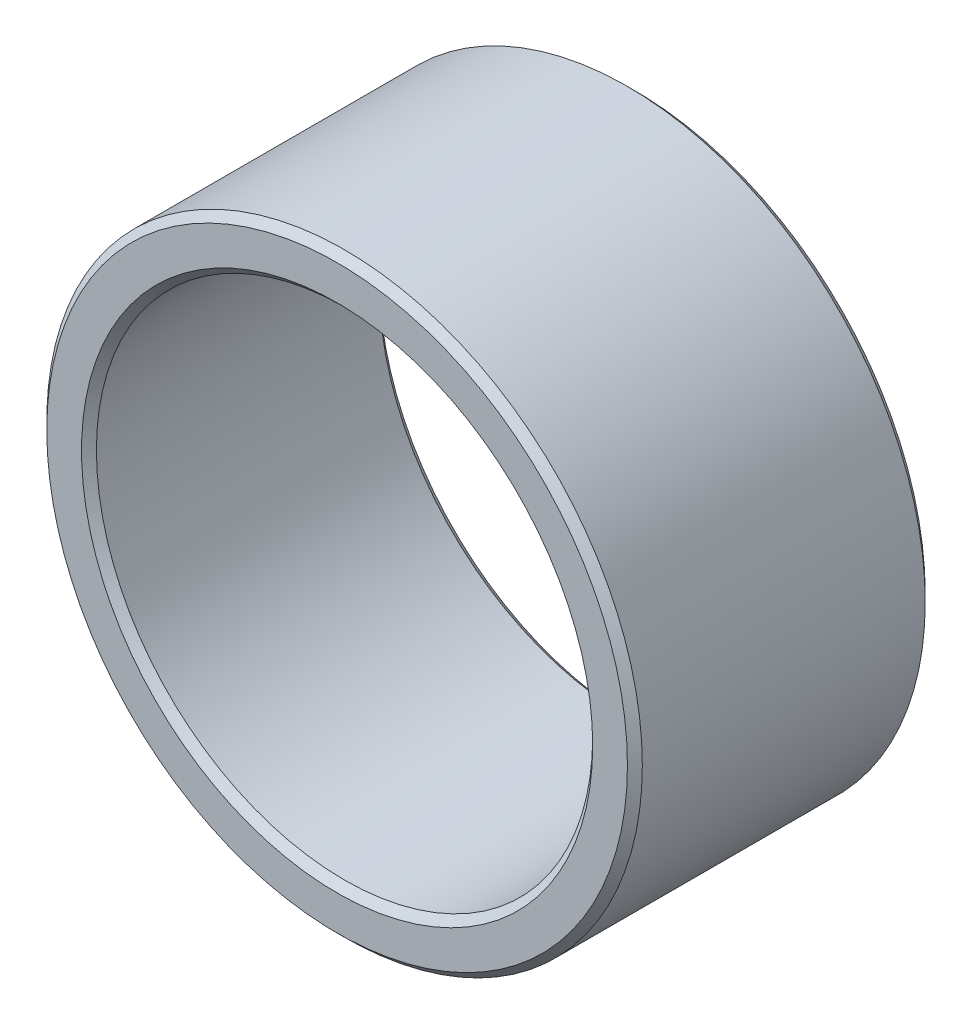
ISO-10303-21;
HEADER;
FILE_DESCRIPTION(('STEP AP214'),'2;1');
FILE_NAME('part.step','',(''),(''),'','','');
FILE_SCHEMA(('AUTOMOTIVE_DESIGN { 1 0 10303 214 1 1 1 1 }'));
ENDSEC;
DATA;
#1=APPLICATION_CONTEXT('core data for automotive mechanical design processes');
#2=APPLICATION_PROTOCOL_DEFINITION('international standard','automotive_design',2000,#1);
#3=PRODUCT_CONTEXT('',#1,'mechanical');
#4=PRODUCT('Part','Part','',(#3));
#5=PRODUCT_RELATED_PRODUCT_CATEGORY('part','',(#4));
#6=PRODUCT_DEFINITION_FORMATION('','',#4);
#7=PRODUCT_DEFINITION_CONTEXT('part definition',#1,'design');
#8=PRODUCT_DEFINITION('design','',#6,#7);
#9=PRODUCT_DEFINITION_SHAPE('','',#8);
#10=(LENGTH_UNIT() NAMED_UNIT(*) SI_UNIT(.MILLI.,.METRE.));
#11=(NAMED_UNIT(*) PLANE_ANGLE_UNIT() SI_UNIT($,.RADIAN.));
#12=(NAMED_UNIT(*) SI_UNIT($,.STERADIAN.) SOLID_ANGLE_UNIT());
#13=UNCERTAINTY_MEASURE_WITH_UNIT(LENGTH_MEASURE(1.E-05),#10,'distance_accuracy_value','');
#14=(GEOMETRIC_REPRESENTATION_CONTEXT(3) GLOBAL_UNCERTAINTY_ASSIGNED_CONTEXT((#13)) GLOBAL_UNIT_ASSIGNED_CONTEXT((#10,
#11,#12)) REPRESENTATION_CONTEXT('',''));
#15=CARTESIAN_POINT('',(0.,0.,0.));
#16=DIRECTION('',(0.,0.,1.));
#17=DIRECTION('',(1.,0.,0.));
#18=AXIS2_PLACEMENT_3D('',#15,#16,#17);
#19=CARTESIAN_POINT('',(0.,0.,12.));
#20=DIRECTION('',(0.,0.,1.));
#21=DIRECTION('',(1.,0.,0.));
#22=AXIS2_PLACEMENT_3D('',#19,#20,#21);
#23=PLANE('',#22);
#24=CARTESIAN_POINT('',(0.,0.,12.));
#25=DIRECTION('',(0.,0.,1.));
#26=DIRECTION('',(1.,0.,0.));
#27=AXIS2_PLACEMENT_3D('',#24,#25,#26);
#28=CIRCLE('',#27,10.3);
#29=CARTESIAN_POINT('',(10.3,0.,12.));
#30=VERTEX_POINT('',#29);
#31=EDGE_CURVE('E10',#30,#30,#28,.F.);
#32=ORIENTED_EDGE('',*,*,#31,.T.);
#33=EDGE_LOOP('',(#32));
#34=FACE_BOUND('',#33,.T.);
#35=CARTESIAN_POINT('',(0.,0.,12.));
#36=DIRECTION('',(0.,0.,1.));
#37=DIRECTION('',(1.,0.,0.));
#38=AXIS2_PLACEMENT_3D('',#35,#36,#37);
#39=CIRCLE('',#38,11.7);
#40=CARTESIAN_POINT('',(11.7,0.,12.));
#41=VERTEX_POINT('',#40);
#42=EDGE_CURVE('E48',#41,#41,#39,.T.);
#43=ORIENTED_EDGE('',*,*,#42,.T.);
#44=EDGE_LOOP('',(#43));
#45=FACE_BOUND('',#44,.T.);
#46=ADVANCED_FACE('F41',(#34,#45),#23,.T.);
#47=CARTESIAN_POINT('',(0.,0.,0.));
#48=DIRECTION('',(0.,0.,1.));
#49=DIRECTION('',(1.,0.,0.));
#50=AXIS2_PLACEMENT_3D('',#47,#48,#49);
#51=PLANE('',#50);
#52=CARTESIAN_POINT('',(0.,0.,0.));
#53=DIRECTION('',(0.,0.,1.));
#54=DIRECTION('',(1.,0.,0.));
#55=AXIS2_PLACEMENT_3D('',#52,#53,#54);
#56=CIRCLE('',#55,10.3);
#57=CARTESIAN_POINT('',(-10.3,0.,0.));
#58=VERTEX_POINT('',#57);
#59=EDGE_CURVE('E67',#58,#58,#56,.T.);
#60=ORIENTED_EDGE('',*,*,#59,.T.);
#61=EDGE_LOOP('',(#60));
#62=FACE_BOUND('',#61,.T.);
#63=CARTESIAN_POINT('',(0.,0.,0.));
#64=DIRECTION('',(0.,0.,1.));
#65=DIRECTION('',(1.,0.,0.));
#66=AXIS2_PLACEMENT_3D('',#63,#64,#65);
#67=CIRCLE('',#66,11.7);
#68=CARTESIAN_POINT('',(11.7,0.,0.));
#69=VERTEX_POINT('',#68);
#70=EDGE_CURVE('E70',#69,#69,#67,.F.);
#71=ORIENTED_EDGE('',*,*,#70,.T.);
#72=EDGE_LOOP('',(#71));
#73=FACE_BOUND('',#72,.T.);
#74=ADVANCED_FACE('F74',(#62,#73),#51,.F.);
#75=CARTESIAN_POINT('',(0.,0.,12.));
#76=DIRECTION('',(0.,0.,-1.));
#77=DIRECTION('',(-1.,0.,0.));
#78=AXIS2_PLACEMENT_3D('',#75,#76,#77);
#79=CYLINDRICAL_SURFACE('',#78,12.);
#80=CARTESIAN_POINT('',(0.,0.,0.299999999999995));
#81=DIRECTION('',(0.,0.,1.));
#82=DIRECTION('',(1.,0.,0.));
#83=AXIS2_PLACEMENT_3D('',#80,#81,#82);
#84=CIRCLE('',#83,12.);
#85=CARTESIAN_POINT('',(12.,0.,0.299999999999995));
#86=VERTEX_POINT('',#85);
#87=EDGE_CURVE('E52',#86,#86,#84,.T.);
#88=ORIENTED_EDGE('',*,*,#87,.T.);
#89=EDGE_LOOP('',(#88));
#90=FACE_BOUND('',#89,.T.);
#91=CARTESIAN_POINT('',(0.,0.,11.7));
#92=DIRECTION('',(0.,0.,1.));
#93=DIRECTION('',(1.,0.,0.));
#94=AXIS2_PLACEMENT_3D('',#91,#92,#93);
#95=CIRCLE('',#94,12.);
#96=CARTESIAN_POINT('',(12.,0.,11.7));
#97=VERTEX_POINT('',#96);
#98=EDGE_CURVE('E56',#97,#97,#95,.F.);
#99=ORIENTED_EDGE('',*,*,#98,.T.);
#100=EDGE_LOOP('',(#99));
#101=FACE_BOUND('',#100,.T.);
#102=ADVANCED_FACE('F84',(#90,#101),#79,.T.);
#103=CARTESIAN_POINT('',(0.,0.,12.));
#104=DIRECTION('',(0.,0.,-1.));
#105=DIRECTION('',(-1.,0.,0.));
#106=AXIS2_PLACEMENT_3D('',#103,#104,#105);
#107=CYLINDRICAL_SURFACE('',#106,10.);
#108=CARTESIAN_POINT('',(0.,0.,0.300000000000005));
#109=DIRECTION('',(0.,0.,1.));
#110=DIRECTION('',(1.,0.,0.));
#111=AXIS2_PLACEMENT_3D('',#108,#109,#110);
#112=CIRCLE('',#111,10.);
#113=CARTESIAN_POINT('',(-10.,0.,0.300000000000005));
#114=VERTEX_POINT('',#113);
#115=EDGE_CURVE('E61',#114,#114,#112,.F.);
#116=ORIENTED_EDGE('',*,*,#115,.T.);
#117=EDGE_LOOP('',(#116));
#118=FACE_BOUND('',#117,.T.);
#119=CARTESIAN_POINT('',(0.,0.,11.7));
#120=DIRECTION('',(0.,0.,1.));
#121=DIRECTION('',(1.,0.,0.));
#122=AXIS2_PLACEMENT_3D('',#119,#120,#121);
#123=CIRCLE('',#122,10.);
#124=CARTESIAN_POINT('',(10.,0.,11.7));
#125=VERTEX_POINT('',#124);
#126=EDGE_CURVE('E64',#125,#125,#123,.T.);
#127=ORIENTED_EDGE('',*,*,#126,.T.);
#128=EDGE_LOOP('',(#127));
#129=FACE_BOUND('',#128,.T.);
#130=ADVANCED_FACE('F87',(#118,#129),#107,.F.);
#131=CARTESIAN_POINT('',(0.,0.,0.));
#132=DIRECTION('',(0.,0.,-1.));
#133=DIRECTION('',(-1.,0.,0.));
#134=AXIS2_PLACEMENT_3D('',#131,#132,#133);
#135=CONICAL_SURFACE('',#134,10.3,0.785398163397443);
#136=CARTESIAN_POINT('',(-10.,0.,0.300000000000005));
#137=CARTESIAN_POINT('',(-10.003125,0.,0.296875000000005));
#138=CARTESIAN_POINT('',(-10.00625,0.,0.293750000000005));
#139=CARTESIAN_POINT('',(-10.0125,0.,0.287500000000005));
#140=CARTESIAN_POINT('',(-10.015625,0.,0.284375000000005));
#141=CARTESIAN_POINT('',(-10.021875,0.,0.278125000000005));
#142=CARTESIAN_POINT('',(-10.025,0.,0.275000000000005));
#143=CARTESIAN_POINT('',(-10.03125,0.,0.268750000000005));
#144=CARTESIAN_POINT('',(-10.034375,0.,0.265625000000004));
#145=CARTESIAN_POINT('',(-10.040625,0.,0.259375000000004));
#146=CARTESIAN_POINT('',(-10.04375,0.,0.256250000000004));
#147=CARTESIAN_POINT('',(-10.05,0.,0.250000000000004));
#148=CARTESIAN_POINT('',(-10.053125,0.,0.246875000000004));
#149=CARTESIAN_POINT('',(-10.059375,0.,0.240625000000004));
#150=CARTESIAN_POINT('',(-10.0625,0.,0.237500000000004));
#151=CARTESIAN_POINT('',(-10.06875,0.,0.231250000000004));
#152=CARTESIAN_POINT('',(-10.071875,0.,0.228125000000004));
#153=CARTESIAN_POINT('',(-10.078125,0.,0.221875000000004));
#154=CARTESIAN_POINT('',(-10.08125,0.,0.218750000000004));
#155=CARTESIAN_POINT('',(-10.0875,0.,0.212500000000004));
#156=CARTESIAN_POINT('',(-10.090625,0.,0.209375000000003));
#157=CARTESIAN_POINT('',(-10.096875,0.,0.203125000000003));
#158=CARTESIAN_POINT('',(-10.1,0.,0.200000000000003));
#159=CARTESIAN_POINT('',(-10.10625,0.,0.193750000000003));
#160=CARTESIAN_POINT('',(-10.109375,0.,0.190625000000003));
#161=CARTESIAN_POINT('',(-10.115625,0.,0.184375000000003));
#162=CARTESIAN_POINT('',(-10.11875,0.,0.181250000000003));
#163=CARTESIAN_POINT('',(-10.125,0.,0.175000000000003));
#164=CARTESIAN_POINT('',(-10.128125,0.,0.171875000000003));
#165=CARTESIAN_POINT('',(-10.134375,0.,0.165625000000003));
#166=CARTESIAN_POINT('',(-10.1375,0.,0.162500000000003));
#167=CARTESIAN_POINT('',(-10.14375,0.,0.156250000000002));
#168=CARTESIAN_POINT('',(-10.146875,0.,0.153125000000002));
#169=CARTESIAN_POINT('',(-10.153125,0.,0.146875000000003));
#170=CARTESIAN_POINT('',(-10.15625,0.,0.143750000000003));
#171=CARTESIAN_POINT('',(-10.1625,0.,0.137500000000002));
#172=CARTESIAN_POINT('',(-10.165625,0.,0.134375000000002));
#173=CARTESIAN_POINT('',(-10.171875,0.,0.128125000000002));
#174=CARTESIAN_POINT('',(-10.175,0.,0.125000000000002));
#175=CARTESIAN_POINT('',(-10.18125,0.,0.118750000000002));
#176=CARTESIAN_POINT('',(-10.184375,0.,0.115625000000002));
#177=CARTESIAN_POINT('',(-10.190625,0.,0.109375000000002));
#178=CARTESIAN_POINT('',(-10.19375,0.,0.106250000000002));
#179=CARTESIAN_POINT('',(-10.2,0.,0.100000000000002));
#180=CARTESIAN_POINT('',(-10.203125,0.,0.0968750000000018));
#181=CARTESIAN_POINT('',(-10.209375,0.,0.0906250000000017));
#182=CARTESIAN_POINT('',(-10.2125,0.,0.0875000000000014));
#183=CARTESIAN_POINT('',(-10.21875,0.,0.0812500000000012));
#184=CARTESIAN_POINT('',(-10.221875,0.,0.0781250000000012));
#185=CARTESIAN_POINT('',(-10.228125,0.,0.0718750000000013));
#186=CARTESIAN_POINT('',(-10.23125,0.,0.0687500000000014));
#187=CARTESIAN_POINT('',(-10.2375,0.,0.0625000000000012));
#188=CARTESIAN_POINT('',(-10.240625,0.,0.0593750000000009));
#189=CARTESIAN_POINT('',(-10.246875,0.,0.0531250000000007));
#190=CARTESIAN_POINT('',(-10.25,0.,0.0500000000000007));
#191=CARTESIAN_POINT('',(-10.25625,0.,0.0437500000000008));
#192=CARTESIAN_POINT('',(-10.259375,0.,0.0406250000000009));
#193=CARTESIAN_POINT('',(-10.265625,0.,0.0343750000000007));
#194=CARTESIAN_POINT('',(-10.26875,0.,0.0312500000000004));
#195=CARTESIAN_POINT('',(-10.275,0.,0.0250000000000003));
#196=CARTESIAN_POINT('',(-10.278125,0.,0.0218750000000005));
#197=CARTESIAN_POINT('',(-10.284375,0.,0.0156250000000004));
#198=CARTESIAN_POINT('',(-10.2875,0.,0.0125000000000002));
#199=CARTESIAN_POINT('',(-10.29375,0.,0.0062499999999998));
#200=CARTESIAN_POINT('',(-10.296875,0.,0.00312499999999958));
#201=CARTESIAN_POINT('',(-10.3,0.,0.));
#202=B_SPLINE_CURVE_WITH_KNOTS('',3,(#136,#137,#138,#139,#140,#141,#142,#143,#144,#145,#146,
#147,#148,#149,#150,#151,#152,#153,#154,#155,#156,#157,#158,#159,#160,#161,#162,#163,#164,#165,
#166,#167,#168,#169,#170,#171,#172,#173,#174,#175,#176,#177,#178,#179,#180,#181,#182,#183,#184,
#185,#186,#187,#188,#189,#190,#191,#192,#193,#194,#195,#196,#197,#198,#199,#200,#201),
.UNSPECIFIED.,.F.,.F.,(4,2,2,2,2,2,2,2,2,2,2,2,2,2,2,2,2,2,2,2,2,2,2,2,2,2,2,2,2,2,2,2,4),(0.,
0.0132582521472484,0.0265165042944955,0.0397747564417439,0.053033008588991,0.0662912607362394,
0.0795495128834878,0.0928077650307349,0.106066017177983,0.119324269325232,0.132582521472479,
0.145840773619727,0.159099025766976,0.172357277914223,0.185615530061471,0.198873782208718,
0.212132034355967,0.225390286503215,0.238648538650462,0.251906790797711,0.265165042944959,
0.278423295092206,0.291681547239454,0.304939799386702,0.31819805153395,0.331456303681198,
0.344714555828446,0.357972807975694,0.371231060122942,0.384489312270189,0.397747564417438,
0.411005816564685,0.424264068711933),.UNSPECIFIED.);
#203=EDGE_CURVE('BSEAM80',#114,#58,#202,.T.);
#204=ORIENTED_EDGE('',*,*,#115,.F.);
#205=ORIENTED_EDGE('',*,*,#59,.F.);
#206=ORIENTED_EDGE('',*,*,#203,.T.);
#207=ORIENTED_EDGE('',*,*,#203,.F.);
#208=EDGE_LOOP('',(#204,#206,#205,#207));
#209=FACE_BOUND('',#208,.T.);
#210=ADVANCED_FACE('F80',(#209),#135,.F.);
#211=CARTESIAN_POINT('',(0.,0.,0.299999999999995));
#212=DIRECTION('',(0.,0.,1.));
#213=DIRECTION('',(1.,0.,0.));
#214=AXIS2_PLACEMENT_3D('',#211,#212,#213);
#215=CONICAL_SURFACE('',#214,12.,0.785398163397448);
#216=ORIENTED_EDGE('',*,*,#70,.F.);
#217=EDGE_LOOP('',(#216));
#218=FACE_BOUND('',#217,.T.);
#219=ORIENTED_EDGE('',*,*,#87,.F.);
#220=EDGE_LOOP('',(#219));
#221=FACE_BOUND('',#220,.T.);
#222=ADVANCED_FACE('F76',(#218,#221),#215,.T.);
#223=CARTESIAN_POINT('',(0.,0.,11.7));
#224=DIRECTION('',(0.,0.,1.));
#225=DIRECTION('',(1.,0.,0.));
#226=AXIS2_PLACEMENT_3D('',#223,#224,#225);
#227=CONICAL_SURFACE('',#226,10.,0.785398163397451);
#228=ORIENTED_EDGE('',*,*,#31,.F.);
#229=EDGE_LOOP('',(#228));
#230=FACE_BOUND('',#229,.T.);
#231=ORIENTED_EDGE('',*,*,#126,.F.);
#232=EDGE_LOOP('',(#231));
#233=FACE_BOUND('',#232,.T.);
#234=ADVANCED_FACE('F79',(#230,#233),#227,.F.);
#235=CARTESIAN_POINT('',(0.,0.,12.));
#236=DIRECTION('',(0.,0.,-1.));
#237=DIRECTION('',(-1.,0.,0.));
#238=AXIS2_PLACEMENT_3D('',#235,#236,#237);
#239=CONICAL_SURFACE('',#238,11.7,0.785398163397443);
#240=ORIENTED_EDGE('',*,*,#98,.F.);
#241=EDGE_LOOP('',(#240));
#242=FACE_BOUND('',#241,.T.);
#243=ORIENTED_EDGE('',*,*,#42,.F.);
#244=EDGE_LOOP('',(#243));
#245=FACE_BOUND('',#244,.T.);
#246=ADVANCED_FACE('F43',(#242,#245),#239,.T.);
#247=CLOSED_SHELL('',(#46,#74,#102,#130,#210,#222,#234,#246));
#248=MANIFOLD_SOLID_BREP('B2',#247);
#249=ADVANCED_BREP_SHAPE_REPRESENTATION('',(#18,#248),#14);
#250=SHAPE_DEFINITION_REPRESENTATION(#9,#249);
ENDSEC;
END-ISO-10303-21;
